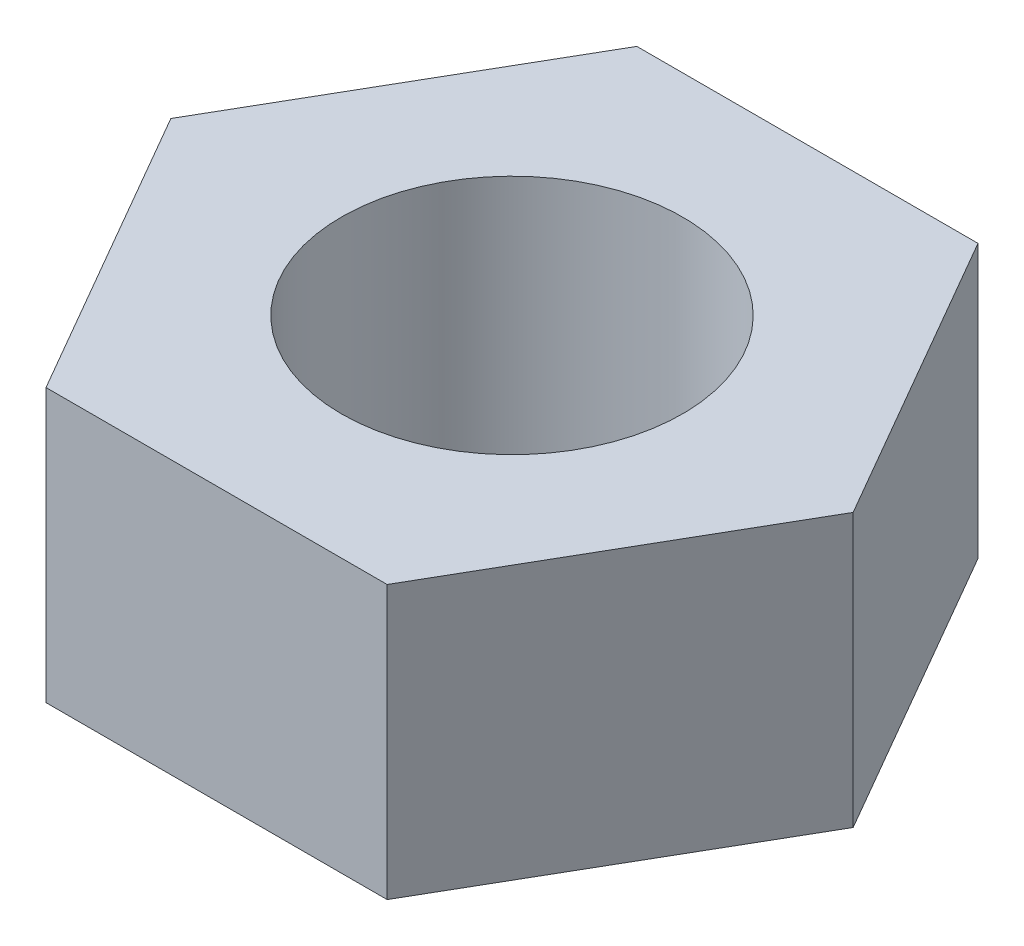
ISO-10303-21;
HEADER;
FILE_DESCRIPTION(('STEP AP214'),'2;1');
FILE_NAME('part.step','',(''),(''),'','','');
FILE_SCHEMA(('AUTOMOTIVE_DESIGN { 1 0 10303 214 1 1 1 1 }'));
ENDSEC;
DATA;
#1=APPLICATION_CONTEXT('core data for automotive mechanical design processes');
#2=APPLICATION_PROTOCOL_DEFINITION('international standard','automotive_design',2000,#1);
#3=PRODUCT_CONTEXT('',#1,'mechanical');
#4=PRODUCT('Part','Part','',(#3));
#5=PRODUCT_RELATED_PRODUCT_CATEGORY('part','',(#4));
#6=PRODUCT_DEFINITION_FORMATION('','',#4);
#7=PRODUCT_DEFINITION_CONTEXT('part definition',#1,'design');
#8=PRODUCT_DEFINITION('design','',#6,#7);
#9=PRODUCT_DEFINITION_SHAPE('','',#8);
#10=(LENGTH_UNIT() NAMED_UNIT(*) SI_UNIT(.MILLI.,.METRE.));
#11=(NAMED_UNIT(*) PLANE_ANGLE_UNIT() SI_UNIT($,.RADIAN.));
#12=(NAMED_UNIT(*) SI_UNIT($,.STERADIAN.) SOLID_ANGLE_UNIT());
#13=UNCERTAINTY_MEASURE_WITH_UNIT(LENGTH_MEASURE(1.E-05),#10,'distance_accuracy_value','');
#14=(GEOMETRIC_REPRESENTATION_CONTEXT(3) GLOBAL_UNCERTAINTY_ASSIGNED_CONTEXT((#13)) GLOBAL_UNIT_ASSIGNED_CONTEXT((#10,
#11,#12)) REPRESENTATION_CONTEXT('',''));
#15=CARTESIAN_POINT('',(0.,0.,0.));
#16=DIRECTION('',(0.,0.,1.));
#17=DIRECTION('',(1.,0.,0.));
#18=AXIS2_PLACEMENT_3D('',#15,#16,#17);
#19=CARTESIAN_POINT('',(0.,2.,0.));
#20=DIRECTION('',(0.,1.,0.));
#21=DIRECTION('',(0.,0.,1.));
#22=AXIS2_PLACEMENT_3D('',#19,#20,#21);
#23=PLANE('',#22);
#24=DIRECTION('',(-0.5,0.,-0.866025403784439));
#25=VECTOR('',#24,1.);
#26=CARTESIAN_POINT('',(2.5,2.,0.));
#27=LINE('',#26,#25);
#28=CARTESIAN_POINT('',(2.5,2.,0.));
#29=VERTEX_POINT('',#28);
#30=CARTESIAN_POINT('',(1.25,2.,-2.1650635094611));
#31=VERTEX_POINT('',#30);
#32=EDGE_CURVE('E150',#29,#31,#27,.T.);
#33=ORIENTED_EDGE('',*,*,#32,.T.);
#34=DIRECTION('',(-1.,0.,0.));
#35=VECTOR('',#34,1.);
#36=CARTESIAN_POINT('',(1.25,2.,-2.1650635094611));
#37=LINE('',#36,#35);
#38=CARTESIAN_POINT('',(-1.25,2.,-2.1650635094611));
#39=VERTEX_POINT('',#38);
#40=EDGE_CURVE('E98',#31,#39,#37,.T.);
#41=ORIENTED_EDGE('',*,*,#40,.T.);
#42=DIRECTION('',(-0.5,0.,0.866025403784439));
#43=VECTOR('',#42,1.);
#44=CARTESIAN_POINT('',(-1.25,2.,-2.1650635094611));
#45=LINE('',#44,#43);
#46=CARTESIAN_POINT('',(-2.5,2.,0.));
#47=VERTEX_POINT('',#46);
#48=EDGE_CURVE('E111',#39,#47,#45,.T.);
#49=ORIENTED_EDGE('',*,*,#48,.T.);
#50=DIRECTION('',(0.5,0.,0.866025403784439));
#51=VECTOR('',#50,1.);
#52=CARTESIAN_POINT('',(-2.5,2.,0.));
#53=LINE('',#52,#51);
#54=CARTESIAN_POINT('',(-1.25,2.,2.1650635094611));
#55=VERTEX_POINT('',#54);
#56=EDGE_CURVE('E105',#47,#55,#53,.T.);
#57=ORIENTED_EDGE('',*,*,#56,.T.);
#58=DIRECTION('',(1.,0.,0.));
#59=VECTOR('',#58,1.);
#60=CARTESIAN_POINT('',(-1.25,2.,2.1650635094611));
#61=LINE('',#60,#59);
#62=CARTESIAN_POINT('',(1.25,2.,2.1650635094611));
#63=VERTEX_POINT('',#62);
#64=EDGE_CURVE('E109',#55,#63,#61,.T.);
#65=ORIENTED_EDGE('',*,*,#64,.T.);
#66=DIRECTION('',(0.5,0.,-0.866025403784439));
#67=VECTOR('',#66,1.);
#68=CARTESIAN_POINT('',(1.25,2.,2.1650635094611));
#69=LINE('',#68,#67);
#70=EDGE_CURVE('E61',#63,#29,#69,.T.);
#71=ORIENTED_EDGE('',*,*,#70,.T.);
#72=EDGE_LOOP('',(#33,#41,#49,#57,#65,#71));
#73=FACE_BOUND('',#72,.T.);
#74=CARTESIAN_POINT('',(0.,2.,0.));
#75=DIRECTION('',(0.,1.,0.));
#76=DIRECTION('',(0.,0.,1.));
#77=AXIS2_PLACEMENT_3D('',#74,#75,#76);
#78=CIRCLE('',#77,1.25);
#79=CARTESIAN_POINT('',(0.,2.,1.25));
#80=VERTEX_POINT('',#79);
#81=EDGE_CURVE('E138',#80,#80,#78,.T.);
#82=ORIENTED_EDGE('',*,*,#81,.F.);
#83=EDGE_LOOP('',(#82));
#84=FACE_BOUND('',#83,.T.);
#85=ADVANCED_FACE('F43',(#73,#84),#23,.T.);
#86=CARTESIAN_POINT('',(0.,0.,0.));
#87=DIRECTION('',(0.,1.,0.));
#88=DIRECTION('',(0.,0.,1.));
#89=AXIS2_PLACEMENT_3D('',#86,#87,#88);
#90=PLANE('',#89);
#91=DIRECTION('',(-0.5,0.,-0.866025403784439));
#92=VECTOR('',#91,1.);
#93=CARTESIAN_POINT('',(2.5,0.,0.));
#94=LINE('',#93,#92);
#95=CARTESIAN_POINT('',(2.5,0.,0.));
#96=VERTEX_POINT('',#95);
#97=CARTESIAN_POINT('',(1.25,0.,-2.1650635094611));
#98=VERTEX_POINT('',#97);
#99=EDGE_CURVE('E133',#96,#98,#94,.T.);
#100=ORIENTED_EDGE('',*,*,#99,.F.);
#101=DIRECTION('',(0.5,0.,-0.866025403784439));
#102=VECTOR('',#101,1.);
#103=CARTESIAN_POINT('',(1.25,0.,2.1650635094611));
#104=LINE('',#103,#102);
#105=CARTESIAN_POINT('',(1.25,0.,2.1650635094611));
#106=VERTEX_POINT('',#105);
#107=EDGE_CURVE('E90',#106,#96,#104,.T.);
#108=ORIENTED_EDGE('',*,*,#107,.F.);
#109=DIRECTION('',(1.,0.,0.));
#110=VECTOR('',#109,1.);
#111=CARTESIAN_POINT('',(-1.25,0.,2.1650635094611));
#112=LINE('',#111,#110);
#113=CARTESIAN_POINT('',(-1.25,0.,2.1650635094611));
#114=VERTEX_POINT('',#113);
#115=EDGE_CURVE('E84',#114,#106,#112,.T.);
#116=ORIENTED_EDGE('',*,*,#115,.F.);
#117=DIRECTION('',(0.5,0.,0.866025403784439));
#118=VECTOR('',#117,1.);
#119=CARTESIAN_POINT('',(-2.5,0.,0.));
#120=LINE('',#119,#118);
#121=CARTESIAN_POINT('',(-2.5,0.,0.));
#122=VERTEX_POINT('',#121);
#123=EDGE_CURVE('E120',#122,#114,#120,.T.);
#124=ORIENTED_EDGE('',*,*,#123,.F.);
#125=DIRECTION('',(-0.5,0.,0.866025403784439));
#126=VECTOR('',#125,1.);
#127=CARTESIAN_POINT('',(-1.25,0.,-2.1650635094611));
#128=LINE('',#127,#126);
#129=CARTESIAN_POINT('',(-1.25,0.,-2.1650635094611));
#130=VERTEX_POINT('',#129);
#131=EDGE_CURVE('E141',#130,#122,#128,.T.);
#132=ORIENTED_EDGE('',*,*,#131,.F.);
#133=DIRECTION('',(-1.,0.,0.));
#134=VECTOR('',#133,1.);
#135=CARTESIAN_POINT('',(1.25,0.,-2.1650635094611));
#136=LINE('',#135,#134);
#137=EDGE_CURVE('E137',#98,#130,#136,.T.);
#138=ORIENTED_EDGE('',*,*,#137,.F.);
#139=EDGE_LOOP('',(#100,#108,#116,#124,#132,#138));
#140=FACE_BOUND('',#139,.T.);
#141=CARTESIAN_POINT('',(0.,0.,0.));
#142=DIRECTION('',(0.,1.,0.));
#143=DIRECTION('',(0.,0.,1.));
#144=AXIS2_PLACEMENT_3D('',#141,#142,#143);
#145=CIRCLE('',#144,1.25);
#146=CARTESIAN_POINT('',(0.,0.,1.25));
#147=VERTEX_POINT('',#146);
#148=EDGE_CURVE('E265',#147,#147,#145,.T.);
#149=ORIENTED_EDGE('',*,*,#148,.T.);
#150=EDGE_LOOP('',(#149));
#151=FACE_BOUND('',#150,.T.);
#152=ADVANCED_FACE('F163',(#140,#151),#90,.F.);
#153=CARTESIAN_POINT('',(2.5,2.,0.));
#154=DIRECTION('',(-0.866025403784439,0.,0.5));
#155=DIRECTION('',(0.5,0.,0.866025403784439));
#156=AXIS2_PLACEMENT_3D('',#153,#154,#155);
#157=PLANE('',#156);
#158=ORIENTED_EDGE('',*,*,#99,.T.);
#159=DIRECTION('',(0.,-1.,0.));
#160=VECTOR('',#159,1.);
#161=CARTESIAN_POINT('',(1.25,2.,-2.1650635094611));
#162=LINE('',#161,#160);
#163=EDGE_CURVE('E11',#31,#98,#162,.T.);
#164=ORIENTED_EDGE('',*,*,#163,.F.);
#165=ORIENTED_EDGE('',*,*,#32,.F.);
#166=DIRECTION('',(0.,-1.,0.));
#167=VECTOR('',#166,1.);
#168=CARTESIAN_POINT('',(2.5,2.,0.));
#169=LINE('',#168,#167);
#170=EDGE_CURVE('E129',#29,#96,#169,.T.);
#171=ORIENTED_EDGE('',*,*,#170,.T.);
#172=EDGE_LOOP('',(#158,#164,#165,#171));
#173=FACE_BOUND('',#172,.T.);
#174=ADVANCED_FACE('F45',(#173),#157,.F.);
#175=CARTESIAN_POINT('',(1.25,2.,-2.1650635094611));
#176=DIRECTION('',(0.,0.,1.));
#177=DIRECTION('',(1.,0.,0.));
#178=AXIS2_PLACEMENT_3D('',#175,#176,#177);
#179=PLANE('',#178);
#180=ORIENTED_EDGE('',*,*,#137,.T.);
#181=DIRECTION('',(0.,-1.,0.));
#182=VECTOR('',#181,1.);
#183=CARTESIAN_POINT('',(-1.25,2.,-2.1650635094611));
#184=LINE('',#183,#182);
#185=EDGE_CURVE('E53',#39,#130,#184,.T.);
#186=ORIENTED_EDGE('',*,*,#185,.F.);
#187=ORIENTED_EDGE('',*,*,#40,.F.);
#188=ORIENTED_EDGE('',*,*,#163,.T.);
#189=EDGE_LOOP('',(#180,#186,#187,#188));
#190=FACE_BOUND('',#189,.T.);
#191=ADVANCED_FACE('F188',(#190),#179,.F.);
#192=CARTESIAN_POINT('',(-1.25,2.,-2.1650635094611));
#193=DIRECTION('',(0.866025403784439,0.,0.5));
#194=DIRECTION('',(0.5,0.,-0.866025403784439));
#195=AXIS2_PLACEMENT_3D('',#192,#193,#194);
#196=PLANE('',#195);
#197=ORIENTED_EDGE('',*,*,#131,.T.);
#198=DIRECTION('',(0.,-1.,0.));
#199=VECTOR('',#198,1.);
#200=CARTESIAN_POINT('',(-2.5,2.,0.));
#201=LINE('',#200,#199);
#202=EDGE_CURVE('E122',#47,#122,#201,.T.);
#203=ORIENTED_EDGE('',*,*,#202,.F.);
#204=ORIENTED_EDGE('',*,*,#48,.F.);
#205=ORIENTED_EDGE('',*,*,#185,.T.);
#206=EDGE_LOOP('',(#197,#203,#204,#205));
#207=FACE_BOUND('',#206,.T.);
#208=ADVANCED_FACE('F160',(#207),#196,.F.);
#209=CARTESIAN_POINT('',(-2.5,2.,0.));
#210=DIRECTION('',(0.866025403784439,0.,-0.5));
#211=DIRECTION('',(-0.5,0.,-0.866025403784439));
#212=AXIS2_PLACEMENT_3D('',#209,#210,#211);
#213=PLANE('',#212);
#214=ORIENTED_EDGE('',*,*,#123,.T.);
#215=DIRECTION('',(0.,-1.,0.));
#216=VECTOR('',#215,1.);
#217=CARTESIAN_POINT('',(-1.25,2.,2.1650635094611));
#218=LINE('',#217,#216);
#219=EDGE_CURVE('E117',#55,#114,#218,.T.);
#220=ORIENTED_EDGE('',*,*,#219,.F.);
#221=ORIENTED_EDGE('',*,*,#56,.F.);
#222=ORIENTED_EDGE('',*,*,#202,.T.);
#223=EDGE_LOOP('',(#214,#220,#221,#222));
#224=FACE_BOUND('',#223,.T.);
#225=ADVANCED_FACE('F118',(#224),#213,.F.);
#226=CARTESIAN_POINT('',(-1.25,2.,2.1650635094611));
#227=DIRECTION('',(0.,0.,-1.));
#228=DIRECTION('',(-1.,0.,0.));
#229=AXIS2_PLACEMENT_3D('',#226,#227,#228);
#230=PLANE('',#229);
#231=ORIENTED_EDGE('',*,*,#115,.T.);
#232=DIRECTION('',(0.,-1.,0.));
#233=VECTOR('',#232,1.);
#234=CARTESIAN_POINT('',(1.25,2.,2.1650635094611));
#235=LINE('',#234,#233);
#236=EDGE_CURVE('E123',#63,#106,#235,.T.);
#237=ORIENTED_EDGE('',*,*,#236,.F.);
#238=ORIENTED_EDGE('',*,*,#64,.F.);
#239=ORIENTED_EDGE('',*,*,#219,.T.);
#240=EDGE_LOOP('',(#231,#237,#238,#239));
#241=FACE_BOUND('',#240,.T.);
#242=ADVANCED_FACE('F125',(#241),#230,.F.);
#243=CARTESIAN_POINT('',(1.25,2.,2.1650635094611));
#244=DIRECTION('',(-0.866025403784439,0.,-0.5));
#245=DIRECTION('',(-0.5,0.,0.866025403784439));
#246=AXIS2_PLACEMENT_3D('',#243,#244,#245);
#247=PLANE('',#246);
#248=ORIENTED_EDGE('',*,*,#107,.T.);
#249=ORIENTED_EDGE('',*,*,#170,.F.);
#250=ORIENTED_EDGE('',*,*,#70,.F.);
#251=ORIENTED_EDGE('',*,*,#236,.T.);
#252=EDGE_LOOP('',(#248,#249,#250,#251));
#253=FACE_BOUND('',#252,.T.);
#254=ADVANCED_FACE('F168',(#253),#247,.F.);
#255=CARTESIAN_POINT('',(0.,2.,0.));
#256=DIRECTION('',(0.,-1.,0.));
#257=DIRECTION('',(0.,0.,-1.));
#258=AXIS2_PLACEMENT_3D('',#255,#256,#257);
#259=CYLINDRICAL_SURFACE('',#258,1.25);
#260=ORIENTED_EDGE('',*,*,#81,.T.);
#261=EDGE_LOOP('',(#260));
#262=FACE_BOUND('',#261,.T.);
#263=ORIENTED_EDGE('',*,*,#148,.F.);
#264=EDGE_LOOP('',(#263));
#265=FACE_BOUND('',#264,.T.);
#266=ADVANCED_FACE('F170',(#262,#265),#259,.F.);
#267=CLOSED_SHELL('',(#85,#152,#174,#191,#208,#225,#242,#254,#266));
#268=MANIFOLD_SOLID_BREP('B2',#267);
#269=ADVANCED_BREP_SHAPE_REPRESENTATION('',(#18,#268),#14);
#270=SHAPE_DEFINITION_REPRESENTATION(#9,#269);
ENDSEC;
END-ISO-10303-21;
